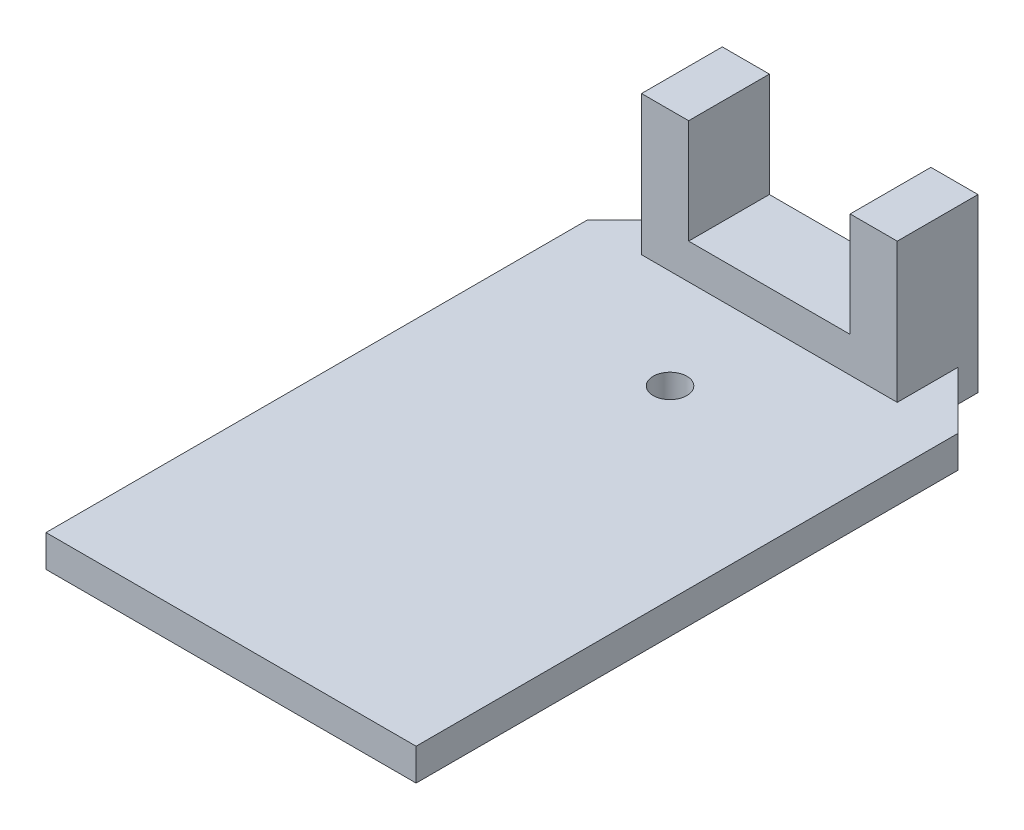
ISO-10303-21;
HEADER;
FILE_DESCRIPTION(('STEP AP214'),'2;1');
FILE_NAME('part.step','',(''),(''),'','','');
FILE_SCHEMA(('AUTOMOTIVE_DESIGN { 1 0 10303 214 1 1 1 1 }'));
ENDSEC;
DATA;
#1=APPLICATION_CONTEXT('core data for automotive mechanical design processes');
#2=APPLICATION_PROTOCOL_DEFINITION('international standard','automotive_design',2000,#1);
#3=PRODUCT_CONTEXT('',#1,'mechanical');
#4=PRODUCT('Part','Part','',(#3));
#5=PRODUCT_RELATED_PRODUCT_CATEGORY('part','',(#4));
#6=PRODUCT_DEFINITION_FORMATION('','',#4);
#7=PRODUCT_DEFINITION_CONTEXT('part definition',#1,'design');
#8=PRODUCT_DEFINITION('design','',#6,#7);
#9=PRODUCT_DEFINITION_SHAPE('','',#8);
#10=(LENGTH_UNIT() NAMED_UNIT(*) SI_UNIT(.MILLI.,.METRE.));
#11=(NAMED_UNIT(*) PLANE_ANGLE_UNIT() SI_UNIT($,.RADIAN.));
#12=(NAMED_UNIT(*) SI_UNIT($,.STERADIAN.) SOLID_ANGLE_UNIT());
#13=UNCERTAINTY_MEASURE_WITH_UNIT(LENGTH_MEASURE(1.E-05),#10,'distance_accuracy_value','');
#14=(GEOMETRIC_REPRESENTATION_CONTEXT(3) GLOBAL_UNCERTAINTY_ASSIGNED_CONTEXT((#13)) GLOBAL_UNIT_ASSIGNED_CONTEXT((#10,
#11,#12)) REPRESENTATION_CONTEXT('',''));
#15=CARTESIAN_POINT('',(0.,0.,0.));
#16=DIRECTION('',(0.,0.,1.));
#17=DIRECTION('',(1.,0.,0.));
#18=AXIS2_PLACEMENT_3D('',#15,#16,#17);
#19=CARTESIAN_POINT('',(0.,0.,12.));
#20=DIRECTION('',(0.,0.,-1.));
#21=DIRECTION('',(-1.,0.,0.));
#22=AXIS2_PLACEMENT_3D('',#19,#20,#21);
#23=PLANE('',#22);
#24=DIRECTION('',(-1.,0.,0.));
#25=VECTOR('',#24,1.);
#26=CARTESIAN_POINT('',(-27.5,-7.99940185010684,12.));
#27=LINE('',#26,#25);
#28=CARTESIAN_POINT('',(19.,-7.99940185010684,12.));
#29=VERTEX_POINT('',#28);
#30=CARTESIAN_POINT('',(-19.,-7.99940185010684,12.));
#31=VERTEX_POINT('',#30);
#32=EDGE_CURVE('E212',#29,#31,#27,.T.);
#33=ORIENTED_EDGE('',*,*,#32,.F.);
#34=DIRECTION('',(0.,1.,0.));
#35=VECTOR('',#34,1.);
#36=CARTESIAN_POINT('',(19.,-12.75,12.));
#37=LINE('',#36,#35);
#38=CARTESIAN_POINT('',(19.,12.75,12.));
#39=VERTEX_POINT('',#38);
#40=EDGE_CURVE('E161',#29,#39,#37,.T.);
#41=ORIENTED_EDGE('',*,*,#40,.T.);
#42=DIRECTION('',(-1.,0.,0.));
#43=VECTOR('',#42,1.);
#44=CARTESIAN_POINT('',(12.,12.75,12.));
#45=LINE('',#44,#43);
#46=CARTESIAN_POINT('',(12.,12.75,12.));
#47=VERTEX_POINT('',#46);
#48=EDGE_CURVE('E163',#39,#47,#45,.T.);
#49=ORIENTED_EDGE('',*,*,#48,.T.);
#50=DIRECTION('',(0.,-1.,0.));
#51=VECTOR('',#50,1.);
#52=CARTESIAN_POINT('',(12.,12.75,12.));
#53=LINE('',#52,#51);
#54=CARTESIAN_POINT('',(12.,-2.75,12.));
#55=VERTEX_POINT('',#54);
#56=EDGE_CURVE('E166',#47,#55,#53,.T.);
#57=ORIENTED_EDGE('',*,*,#56,.T.);
#58=DIRECTION('',(-1.,0.,0.));
#59=VECTOR('',#58,1.);
#60=CARTESIAN_POINT('',(-12.,-2.75,12.));
#61=LINE('',#60,#59);
#62=CARTESIAN_POINT('',(-12.,-2.75,12.));
#63=VERTEX_POINT('',#62);
#64=EDGE_CURVE('E168',#55,#63,#61,.T.);
#65=ORIENTED_EDGE('',*,*,#64,.T.);
#66=DIRECTION('',(0.,1.,0.));
#67=VECTOR('',#66,1.);
#68=CARTESIAN_POINT('',(-12.,12.75,12.));
#69=LINE('',#68,#67);
#70=CARTESIAN_POINT('',(-12.,12.75,12.));
#71=VERTEX_POINT('',#70);
#72=EDGE_CURVE('E170',#63,#71,#69,.T.);
#73=ORIENTED_EDGE('',*,*,#72,.T.);
#74=DIRECTION('',(-1.,0.,0.));
#75=VECTOR('',#74,1.);
#76=CARTESIAN_POINT('',(-19.,12.75,12.));
#77=LINE('',#76,#75);
#78=CARTESIAN_POINT('',(-19.,12.75,12.));
#79=VERTEX_POINT('',#78);
#80=EDGE_CURVE('E172',#71,#79,#77,.T.);
#81=ORIENTED_EDGE('',*,*,#80,.T.);
#82=DIRECTION('',(0.,-1.,0.));
#83=VECTOR('',#82,1.);
#84=CARTESIAN_POINT('',(-19.,-12.75,12.));
#85=LINE('',#84,#83);
#86=EDGE_CURVE('E174',#79,#31,#85,.T.);
#87=ORIENTED_EDGE('',*,*,#86,.T.);
#88=EDGE_LOOP('',(#33,#41,#49,#57,#65,#73,#81,#87));
#89=FACE_BOUND('',#88,.T.);
#90=ADVANCED_FACE('F33',(#89),#23,.F.);
#91=CARTESIAN_POINT('',(19.,-12.75,12.));
#92=DIRECTION('',(-1.,0.,0.));
#93=DIRECTION('',(0.,-1.,0.));
#94=AXIS2_PLACEMENT_3D('',#91,#92,#93);
#95=PLANE('',#94);
#96=ORIENTED_EDGE('',*,*,#40,.F.);
#97=DIRECTION('',(0.,0.,-1.));
#98=VECTOR('',#97,1.);
#99=CARTESIAN_POINT('',(19.,-7.99940185010684,92.));
#100=LINE('',#99,#98);
#101=CARTESIAN_POINT('',(19.,-7.99940185010684,2.99999999999994));
#102=VERTEX_POINT('',#101);
#103=EDGE_CURVE('E216',#29,#102,#100,.T.);
#104=ORIENTED_EDGE('',*,*,#103,.T.);
#105=DIRECTION('',(0.,-1.,0.));
#106=VECTOR('',#105,1.);
#107=CARTESIAN_POINT('',(19.,-12.75,2.99999999999994));
#108=LINE('',#107,#106);
#109=CARTESIAN_POINT('',(19.,-12.75,2.99999999999994));
#110=VERTEX_POINT('',#109);
#111=EDGE_CURVE('E213',#102,#110,#108,.T.);
#112=ORIENTED_EDGE('',*,*,#111,.T.);
#113=DIRECTION('',(0.,0.,-1.));
#114=VECTOR('',#113,1.);
#115=CARTESIAN_POINT('',(19.,-12.75,12.));
#116=LINE('',#115,#114);
#117=CARTESIAN_POINT('',(19.,-12.75,0.));
#118=VERTEX_POINT('',#117);
#119=EDGE_CURVE('E176',#110,#118,#116,.T.);
#120=ORIENTED_EDGE('',*,*,#119,.T.);
#121=DIRECTION('',(0.,1.,0.));
#122=VECTOR('',#121,1.);
#123=CARTESIAN_POINT('',(19.,-12.75,0.));
#124=LINE('',#123,#122);
#125=CARTESIAN_POINT('',(19.,12.75,0.));
#126=VERTEX_POINT('',#125);
#127=EDGE_CURVE('E152',#118,#126,#124,.T.);
#128=ORIENTED_EDGE('',*,*,#127,.T.);
#129=DIRECTION('',(0.,0.,-1.));
#130=VECTOR('',#129,1.);
#131=CARTESIAN_POINT('',(19.,12.75,12.));
#132=LINE('',#131,#130);
#133=EDGE_CURVE('E209',#39,#126,#132,.T.);
#134=ORIENTED_EDGE('',*,*,#133,.F.);
#135=EDGE_LOOP('',(#96,#104,#112,#120,#128,#134));
#136=FACE_BOUND('',#135,.T.);
#137=ADVANCED_FACE('F260',(#136),#95,.F.);
#138=CARTESIAN_POINT('',(12.,12.75,12.));
#139=DIRECTION('',(0.,-1.,0.));
#140=DIRECTION('',(0.,0.,-1.));
#141=AXIS2_PLACEMENT_3D('',#138,#139,#140);
#142=PLANE('',#141);
#143=DIRECTION('',(-1.,0.,0.));
#144=VECTOR('',#143,1.);
#145=CARTESIAN_POINT('',(12.,12.75,0.));
#146=LINE('',#145,#144);
#147=CARTESIAN_POINT('',(12.,12.75,0.));
#148=VERTEX_POINT('',#147);
#149=EDGE_CURVE('E155',#126,#148,#146,.T.);
#150=ORIENTED_EDGE('',*,*,#149,.T.);
#151=DIRECTION('',(0.,0.,-1.));
#152=VECTOR('',#151,1.);
#153=CARTESIAN_POINT('',(12.,12.75,12.));
#154=LINE('',#153,#152);
#155=EDGE_CURVE('E206',#47,#148,#154,.T.);
#156=ORIENTED_EDGE('',*,*,#155,.F.);
#157=ORIENTED_EDGE('',*,*,#48,.F.);
#158=ORIENTED_EDGE('',*,*,#133,.T.);
#159=EDGE_LOOP('',(#150,#156,#157,#158));
#160=FACE_BOUND('',#159,.T.);
#161=ADVANCED_FACE('F276',(#160),#142,.F.);
#162=CARTESIAN_POINT('',(12.,12.75,12.));
#163=DIRECTION('',(1.,0.,0.));
#164=DIRECTION('',(0.,1.,0.));
#165=AXIS2_PLACEMENT_3D('',#162,#163,#164);
#166=PLANE('',#165);
#167=DIRECTION('',(0.,-1.,0.));
#168=VECTOR('',#167,1.);
#169=CARTESIAN_POINT('',(12.,12.75,0.));
#170=LINE('',#169,#168);
#171=CARTESIAN_POINT('',(12.,-2.75,0.));
#172=VERTEX_POINT('',#171);
#173=EDGE_CURVE('E179',#148,#172,#170,.T.);
#174=ORIENTED_EDGE('',*,*,#173,.T.);
#175=DIRECTION('',(0.,0.,-1.));
#176=VECTOR('',#175,1.);
#177=CARTESIAN_POINT('',(12.,-2.75,12.));
#178=LINE('',#177,#176);
#179=EDGE_CURVE('E203',#55,#172,#178,.T.);
#180=ORIENTED_EDGE('',*,*,#179,.F.);
#181=ORIENTED_EDGE('',*,*,#56,.F.);
#182=ORIENTED_EDGE('',*,*,#155,.T.);
#183=EDGE_LOOP('',(#174,#180,#181,#182));
#184=FACE_BOUND('',#183,.T.);
#185=ADVANCED_FACE('F281',(#184),#166,.F.);
#186=CARTESIAN_POINT('',(-12.,-2.75,12.));
#187=DIRECTION('',(0.,-1.,0.));
#188=DIRECTION('',(0.,0.,-1.));
#189=AXIS2_PLACEMENT_3D('',#186,#187,#188);
#190=PLANE('',#189);
#191=DIRECTION('',(-1.,0.,0.));
#192=VECTOR('',#191,1.);
#193=CARTESIAN_POINT('',(-12.,-2.75,0.));
#194=LINE('',#193,#192);
#195=CARTESIAN_POINT('',(-12.,-2.75,0.));
#196=VERTEX_POINT('',#195);
#197=EDGE_CURVE('E181',#172,#196,#194,.T.);
#198=ORIENTED_EDGE('',*,*,#197,.T.);
#199=DIRECTION('',(0.,0.,-1.));
#200=VECTOR('',#199,1.);
#201=CARTESIAN_POINT('',(-12.,-2.75,12.));
#202=LINE('',#201,#200);
#203=EDGE_CURVE('E200',#63,#196,#202,.T.);
#204=ORIENTED_EDGE('',*,*,#203,.F.);
#205=ORIENTED_EDGE('',*,*,#64,.F.);
#206=ORIENTED_EDGE('',*,*,#179,.T.);
#207=EDGE_LOOP('',(#198,#204,#205,#206));
#208=FACE_BOUND('',#207,.T.);
#209=ADVANCED_FACE('F285',(#208),#190,.F.);
#210=CARTESIAN_POINT('',(-12.,12.75,12.));
#211=DIRECTION('',(-1.,0.,0.));
#212=DIRECTION('',(0.,-1.,0.));
#213=AXIS2_PLACEMENT_3D('',#210,#211,#212);
#214=PLANE('',#213);
#215=DIRECTION('',(0.,1.,0.));
#216=VECTOR('',#215,1.);
#217=CARTESIAN_POINT('',(-12.,12.75,0.));
#218=LINE('',#217,#216);
#219=CARTESIAN_POINT('',(-12.,12.75,0.));
#220=VERTEX_POINT('',#219);
#221=EDGE_CURVE('E183',#196,#220,#218,.T.);
#222=ORIENTED_EDGE('',*,*,#221,.T.);
#223=DIRECTION('',(0.,0.,-1.));
#224=VECTOR('',#223,1.);
#225=CARTESIAN_POINT('',(-12.,12.75,12.));
#226=LINE('',#225,#224);
#227=EDGE_CURVE('E197',#71,#220,#226,.T.);
#228=ORIENTED_EDGE('',*,*,#227,.F.);
#229=ORIENTED_EDGE('',*,*,#72,.F.);
#230=ORIENTED_EDGE('',*,*,#203,.T.);
#231=EDGE_LOOP('',(#222,#228,#229,#230));
#232=FACE_BOUND('',#231,.T.);
#233=ADVANCED_FACE('F288',(#232),#214,.F.);
#234=CARTESIAN_POINT('',(-19.,12.75,12.));
#235=DIRECTION('',(0.,-1.,0.));
#236=DIRECTION('',(0.,0.,-1.));
#237=AXIS2_PLACEMENT_3D('',#234,#235,#236);
#238=PLANE('',#237);
#239=DIRECTION('',(-1.,0.,0.));
#240=VECTOR('',#239,1.);
#241=CARTESIAN_POINT('',(-19.,12.75,0.));
#242=LINE('',#241,#240);
#243=CARTESIAN_POINT('',(-19.,12.75,0.));
#244=VERTEX_POINT('',#243);
#245=EDGE_CURVE('E185',#220,#244,#242,.T.);
#246=ORIENTED_EDGE('',*,*,#245,.T.);
#247=DIRECTION('',(0.,0.,-1.));
#248=VECTOR('',#247,1.);
#249=CARTESIAN_POINT('',(-19.,12.75,12.));
#250=LINE('',#249,#248);
#251=EDGE_CURVE('E194',#79,#244,#250,.T.);
#252=ORIENTED_EDGE('',*,*,#251,.F.);
#253=ORIENTED_EDGE('',*,*,#80,.F.);
#254=ORIENTED_EDGE('',*,*,#227,.T.);
#255=EDGE_LOOP('',(#246,#252,#253,#254));
#256=FACE_BOUND('',#255,.T.);
#257=ADVANCED_FACE('F250',(#256),#238,.F.);
#258=CARTESIAN_POINT('',(-19.,-12.75,12.));
#259=DIRECTION('',(1.,0.,0.));
#260=DIRECTION('',(0.,0.,-1.));
#261=AXIS2_PLACEMENT_3D('',#258,#259,#260);
#262=PLANE('',#261);
#263=DIRECTION('',(0.,0.,-1.));
#264=VECTOR('',#263,1.);
#265=CARTESIAN_POINT('',(-19.,-12.75,12.));
#266=LINE('',#265,#264);
#267=CARTESIAN_POINT('',(-19.,-12.75,2.99999999999994));
#268=VERTEX_POINT('',#267);
#269=CARTESIAN_POINT('',(-19.,-12.75,0.));
#270=VERTEX_POINT('',#269);
#271=EDGE_CURVE('E192',#268,#270,#266,.T.);
#272=ORIENTED_EDGE('',*,*,#271,.F.);
#273=DIRECTION('',(0.,1.,0.));
#274=VECTOR('',#273,1.);
#275=CARTESIAN_POINT('',(-19.,-12.75,2.99999999999994));
#276=LINE('',#275,#274);
#277=CARTESIAN_POINT('',(-19.,-7.99940185010684,2.99999999999994));
#278=VERTEX_POINT('',#277);
#279=EDGE_CURVE('E221',#268,#278,#276,.T.);
#280=ORIENTED_EDGE('',*,*,#279,.T.);
#281=DIRECTION('',(0.,0.,1.));
#282=VECTOR('',#281,1.);
#283=CARTESIAN_POINT('',(-19.,-7.99940185010684,92.));
#284=LINE('',#283,#282);
#285=EDGE_CURVE('E219',#278,#31,#284,.T.);
#286=ORIENTED_EDGE('',*,*,#285,.T.);
#287=ORIENTED_EDGE('',*,*,#86,.F.);
#288=ORIENTED_EDGE('',*,*,#251,.T.);
#289=DIRECTION('',(0.,-1.,0.));
#290=VECTOR('',#289,1.);
#291=CARTESIAN_POINT('',(-19.,-12.75,0.));
#292=LINE('',#291,#290);
#293=EDGE_CURVE('E187',#244,#270,#292,.T.);
#294=ORIENTED_EDGE('',*,*,#293,.T.);
#295=EDGE_LOOP('',(#272,#280,#286,#287,#288,#294));
#296=FACE_BOUND('',#295,.T.);
#297=ADVANCED_FACE('F235',(#296),#262,.F.);
#298=CARTESIAN_POINT('',(-19.,-12.75,12.));
#299=DIRECTION('',(0.,1.,0.));
#300=DIRECTION('',(0.,0.,1.));
#301=AXIS2_PLACEMENT_3D('',#298,#299,#300);
#302=PLANE('',#301);
#303=CARTESIAN_POINT('',(0.,-12.75,26.7652853757809));
#304=DIRECTION('',(0.,1.,0.));
#305=DIRECTION('',(0.,0.,1.));
#306=AXIS2_PLACEMENT_3D('',#303,#304,#305);
#307=CIRCLE('',#306,2.5);
#308=CARTESIAN_POINT('',(0.,-12.75,29.2652853757809));
#309=VERTEX_POINT('',#308);
#310=EDGE_CURVE('E146',#309,#309,#307,.T.);
#311=ORIENTED_EDGE('',*,*,#310,.T.);
#312=EDGE_LOOP('',(#311));
#313=FACE_BOUND('',#312,.T.);
#314=DIRECTION('',(1.,0.,0.));
#315=VECTOR('',#314,1.);
#316=CARTESIAN_POINT('',(-19.,-12.75,0.));
#317=LINE('',#316,#315);
#318=EDGE_CURVE('E164',#270,#118,#317,.T.);
#319=ORIENTED_EDGE('',*,*,#318,.T.);
#320=ORIENTED_EDGE('',*,*,#119,.F.);
#321=DIRECTION('',(0.707106781186551,0.,0.707106781186544));
#322=VECTOR('',#321,1.);
#323=CARTESIAN_POINT('',(4.49999999999984,-12.75,-11.5000000000001));
#324=LINE('',#323,#322);
#325=CARTESIAN_POINT('',(27.5,-12.75,11.4999999999998));
#326=VERTEX_POINT('',#325);
#327=EDGE_CURVE('E229',#110,#326,#324,.T.);
#328=ORIENTED_EDGE('',*,*,#327,.T.);
#329=DIRECTION('',(0.,0.,-1.));
#330=VECTOR('',#329,1.);
#331=CARTESIAN_POINT('',(27.5,-12.75,92.));
#332=LINE('',#331,#330);
#333=CARTESIAN_POINT('',(27.5,-12.75,92.));
#334=VERTEX_POINT('',#333);
#335=EDGE_CURVE('E137',#334,#326,#332,.T.);
#336=ORIENTED_EDGE('',*,*,#335,.F.);
#337=DIRECTION('',(1.,0.,0.));
#338=VECTOR('',#337,1.);
#339=CARTESIAN_POINT('',(-27.5,-12.75,92.));
#340=LINE('',#339,#338);
#341=CARTESIAN_POINT('',(-27.5,-12.75,92.));
#342=VERTEX_POINT('',#341);
#343=EDGE_CURVE('E132',#342,#334,#340,.T.);
#344=ORIENTED_EDGE('',*,*,#343,.F.);
#345=DIRECTION('',(0.,0.,-1.));
#346=VECTOR('',#345,1.);
#347=CARTESIAN_POINT('',(-27.5,-12.75,92.));
#348=LINE('',#347,#346);
#349=CARTESIAN_POINT('',(-27.5,-12.75,11.4999999999998));
#350=VERTEX_POINT('',#349);
#351=EDGE_CURVE('E56',#342,#350,#348,.T.);
#352=ORIENTED_EDGE('',*,*,#351,.T.);
#353=DIRECTION('',(0.707106781186551,0.,-0.707106781186544));
#354=VECTOR('',#353,1.);
#355=CARTESIAN_POINT('',(-23.5,-12.75,7.49999999999992));
#356=LINE('',#355,#354);
#357=EDGE_CURVE('E41',#350,#268,#356,.T.);
#358=ORIENTED_EDGE('',*,*,#357,.T.);
#359=ORIENTED_EDGE('',*,*,#271,.T.);
#360=EDGE_LOOP('',(#319,#320,#328,#336,#344,#352,#358,#359));
#361=FACE_BOUND('',#360,.T.);
#362=ADVANCED_FACE('F135',(#313,#361),#302,.F.);
#363=CARTESIAN_POINT('',(0.,0.,0.));
#364=DIRECTION('',(0.,0.,-1.));
#365=DIRECTION('',(-1.,0.,0.));
#366=AXIS2_PLACEMENT_3D('',#363,#364,#365);
#367=PLANE('',#366);
#368=ORIENTED_EDGE('',*,*,#127,.F.);
#369=ORIENTED_EDGE('',*,*,#318,.F.);
#370=ORIENTED_EDGE('',*,*,#293,.F.);
#371=ORIENTED_EDGE('',*,*,#245,.F.);
#372=ORIENTED_EDGE('',*,*,#221,.F.);
#373=ORIENTED_EDGE('',*,*,#197,.F.);
#374=ORIENTED_EDGE('',*,*,#173,.F.);
#375=ORIENTED_EDGE('',*,*,#149,.F.);
#376=EDGE_LOOP('',(#368,#369,#370,#371,#372,#373,#374,#375));
#377=FACE_BOUND('',#376,.T.);
#378=ADVANCED_FACE('F254',(#377),#367,.T.);
#379=CARTESIAN_POINT('',(-27.5,-12.75,92.));
#380=DIRECTION('',(1.,0.,0.));
#381=DIRECTION('',(0.,0.,-1.));
#382=AXIS2_PLACEMENT_3D('',#379,#380,#381);
#383=PLANE('',#382);
#384=DIRECTION('',(0.,0.,-1.));
#385=VECTOR('',#384,1.);
#386=CARTESIAN_POINT('',(-27.5,-7.99940185010684,92.));
#387=LINE('',#386,#385);
#388=CARTESIAN_POINT('',(-27.5,-7.99940185010684,92.));
#389=VERTEX_POINT('',#388);
#390=CARTESIAN_POINT('',(-27.5,-7.99940185010684,11.4999999999998));
#391=VERTEX_POINT('',#390);
#392=EDGE_CURVE('E48',#389,#391,#387,.T.);
#393=ORIENTED_EDGE('',*,*,#392,.T.);
#394=DIRECTION('',(0.,-1.,0.));
#395=VECTOR('',#394,1.);
#396=CARTESIAN_POINT('',(-27.5,-12.75,11.4999999999998));
#397=LINE('',#396,#395);
#398=EDGE_CURVE('E150',#391,#350,#397,.T.);
#399=ORIENTED_EDGE('',*,*,#398,.T.);
#400=ORIENTED_EDGE('',*,*,#351,.F.);
#401=DIRECTION('',(0.,-1.,0.));
#402=VECTOR('',#401,1.);
#403=CARTESIAN_POINT('',(-27.5,-12.75,92.));
#404=LINE('',#403,#402);
#405=EDGE_CURVE('E141',#389,#342,#404,.T.);
#406=ORIENTED_EDGE('',*,*,#405,.F.);
#407=EDGE_LOOP('',(#393,#399,#400,#406));
#408=FACE_BOUND('',#407,.T.);
#409=ADVANCED_FACE('F148',(#408),#383,.F.);
#410=CARTESIAN_POINT('',(27.5,-12.75,92.));
#411=DIRECTION('',(-1.,0.,0.));
#412=DIRECTION('',(0.,0.,1.));
#413=AXIS2_PLACEMENT_3D('',#410,#411,#412);
#414=PLANE('',#413);
#415=ORIENTED_EDGE('',*,*,#335,.T.);
#416=DIRECTION('',(0.,1.,0.));
#417=VECTOR('',#416,1.);
#418=CARTESIAN_POINT('',(27.5,-12.75,11.4999999999998));
#419=LINE('',#418,#417);
#420=CARTESIAN_POINT('',(27.5,-7.99940185010684,11.4999999999998));
#421=VERTEX_POINT('',#420);
#422=EDGE_CURVE('E224',#326,#421,#419,.T.);
#423=ORIENTED_EDGE('',*,*,#422,.T.);
#424=DIRECTION('',(0.,0.,-1.));
#425=VECTOR('',#424,1.);
#426=CARTESIAN_POINT('',(27.5,-7.99940185010684,92.));
#427=LINE('',#426,#425);
#428=CARTESIAN_POINT('',(27.5,-7.99940185010684,92.));
#429=VERTEX_POINT('',#428);
#430=EDGE_CURVE('E157',#429,#421,#427,.T.);
#431=ORIENTED_EDGE('',*,*,#430,.F.);
#432=DIRECTION('',(0.,1.,0.));
#433=VECTOR('',#432,1.);
#434=CARTESIAN_POINT('',(27.5,-12.75,92.));
#435=LINE('',#434,#433);
#436=EDGE_CURVE('E140',#334,#429,#435,.T.);
#437=ORIENTED_EDGE('',*,*,#436,.F.);
#438=EDGE_LOOP('',(#415,#423,#431,#437));
#439=FACE_BOUND('',#438,.T.);
#440=ADVANCED_FACE('F268',(#439),#414,.F.);
#441=CARTESIAN_POINT('',(-27.5,-7.99940185010684,92.));
#442=DIRECTION('',(0.,-1.,0.));
#443=DIRECTION('',(0.,0.,-1.));
#444=AXIS2_PLACEMENT_3D('',#441,#442,#443);
#445=PLANE('',#444);
#446=CARTESIAN_POINT('',(0.,-7.99940185010684,26.7652853757809));
#447=DIRECTION('',(0.,1.,0.));
#448=DIRECTION('',(0.,0.,1.));
#449=AXIS2_PLACEMENT_3D('',#446,#447,#448);
#450=CIRCLE('',#449,2.5);
#451=CARTESIAN_POINT('',(0.,-7.99940185010684,29.2652853757809));
#452=VERTEX_POINT('',#451);
#453=EDGE_CURVE('E433',#452,#452,#450,.T.);
#454=ORIENTED_EDGE('',*,*,#453,.F.);
#455=EDGE_LOOP('',(#454));
#456=FACE_BOUND('',#455,.T.);
#457=ORIENTED_EDGE('',*,*,#430,.T.);
#458=DIRECTION('',(-0.707106781186551,0.,-0.707106781186544));
#459=VECTOR('',#458,1.);
#460=CARTESIAN_POINT('',(40.2499999999998,-7.99940185010684,24.2499999999995));
#461=LINE('',#460,#459);
#462=EDGE_CURVE('E227',#421,#102,#461,.T.);
#463=ORIENTED_EDGE('',*,*,#462,.T.);
#464=ORIENTED_EDGE('',*,*,#103,.F.);
#465=ORIENTED_EDGE('',*,*,#32,.T.);
#466=ORIENTED_EDGE('',*,*,#285,.F.);
#467=DIRECTION('',(-0.707106781186551,0.,0.707106781186544));
#468=VECTOR('',#467,1.);
#469=CARTESIAN_POINT('',(-67.7500000000001,-7.99940185010684,51.7499999999995));
#470=LINE('',#469,#468);
#471=EDGE_CURVE('E11',#278,#391,#470,.T.);
#472=ORIENTED_EDGE('',*,*,#471,.T.);
#473=ORIENTED_EDGE('',*,*,#392,.F.);
#474=DIRECTION('',(-1.,0.,0.));
#475=VECTOR('',#474,1.);
#476=CARTESIAN_POINT('',(-27.5,-7.99940185010684,92.));
#477=LINE('',#476,#475);
#478=EDGE_CURVE('E145',#429,#389,#477,.T.);
#479=ORIENTED_EDGE('',*,*,#478,.F.);
#480=EDGE_LOOP('',(#457,#463,#464,#465,#466,#472,#473,#479));
#481=FACE_BOUND('',#480,.T.);
#482=ADVANCED_FACE('F241',(#456,#481),#445,.F.);
#483=CARTESIAN_POINT('',(0.,0.,92.));
#484=DIRECTION('',(0.,0.,-1.));
#485=DIRECTION('',(-1.,0.,0.));
#486=AXIS2_PLACEMENT_3D('',#483,#484,#485);
#487=PLANE('',#486);
#488=ORIENTED_EDGE('',*,*,#405,.T.);
#489=ORIENTED_EDGE('',*,*,#343,.T.);
#490=ORIENTED_EDGE('',*,*,#436,.T.);
#491=ORIENTED_EDGE('',*,*,#478,.T.);
#492=EDGE_LOOP('',(#488,#489,#490,#491));
#493=FACE_BOUND('',#492,.T.);
#494=ADVANCED_FACE('F143',(#493),#487,.F.);
#495=CARTESIAN_POINT('',(28.0000000000002,0.,12.));
#496=DIRECTION('',(-0.707106781186544,0.,0.707106781186551));
#497=DIRECTION('',(0.,1.,0.));
#498=AXIS2_PLACEMENT_3D('',#495,#496,#497);
#499=PLANE('',#498);
#500=ORIENTED_EDGE('',*,*,#327,.F.);
#501=ORIENTED_EDGE('',*,*,#111,.F.);
#502=ORIENTED_EDGE('',*,*,#462,.F.);
#503=ORIENTED_EDGE('',*,*,#422,.F.);
#504=EDGE_LOOP('',(#500,#501,#502,#503));
#505=FACE_BOUND('',#504,.T.);
#506=ADVANCED_FACE('F265',(#505),#499,.F.);
#507=CARTESIAN_POINT('',(-28.0000000000002,0.,12.));
#508=DIRECTION('',(0.707106781186544,0.,0.707106781186551));
#509=DIRECTION('',(0.,-1.,0.));
#510=AXIS2_PLACEMENT_3D('',#507,#508,#509);
#511=PLANE('',#510);
#512=ORIENTED_EDGE('',*,*,#471,.F.);
#513=ORIENTED_EDGE('',*,*,#279,.F.);
#514=ORIENTED_EDGE('',*,*,#357,.F.);
#515=ORIENTED_EDGE('',*,*,#398,.F.);
#516=EDGE_LOOP('',(#512,#513,#514,#515));
#517=FACE_BOUND('',#516,.T.);
#518=ADVANCED_FACE('F35',(#517),#511,.F.);
#519=CARTESIAN_POINT('',(0.,-87.9994018501068,26.7652853757809));
#520=DIRECTION('',(0.,1.,0.));
#521=DIRECTION('',(0.,0.,1.));
#522=AXIS2_PLACEMENT_3D('',#519,#520,#521);
#523=CYLINDRICAL_SURFACE('',#522,2.5);
#524=ORIENTED_EDGE('',*,*,#453,.T.);
#525=EDGE_LOOP('',(#524));
#526=FACE_BOUND('',#525,.T.);
#527=ORIENTED_EDGE('',*,*,#310,.F.);
#528=EDGE_LOOP('',(#527));
#529=FACE_BOUND('',#528,.T.);
#530=ADVANCED_FACE('F360',(#526,#529),#523,.F.);
#531=CLOSED_SHELL('',(#90,#137,#161,#185,#209,#233,#257,#297,#362,#378,#409,#440,#482,#494,#506,
#518,#530));
#532=MANIFOLD_SOLID_BREP('B2',#531);
#533=ADVANCED_BREP_SHAPE_REPRESENTATION('',(#18,#532),#14);
#534=SHAPE_DEFINITION_REPRESENTATION(#9,#533);
ENDSEC;
END-ISO-10303-21;
